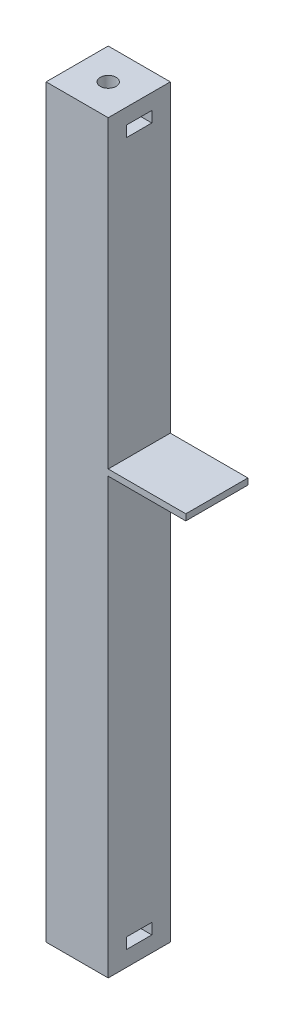
ISO-10303-21;
HEADER;
FILE_DESCRIPTION(('STEP AP214'),'2;1');
FILE_NAME('part.step','',(''),(''),'','','');
FILE_SCHEMA(('AUTOMOTIVE_DESIGN { 1 0 10303 214 1 1 1 1 }'));
ENDSEC;
DATA;
#1=APPLICATION_CONTEXT('core data for automotive mechanical design processes');
#2=APPLICATION_PROTOCOL_DEFINITION('international standard','automotive_design',2000,#1);
#3=PRODUCT_CONTEXT('',#1,'mechanical');
#4=PRODUCT('Part','Part','',(#3));
#5=PRODUCT_RELATED_PRODUCT_CATEGORY('part','',(#4));
#6=PRODUCT_DEFINITION_FORMATION('','',#4);
#7=PRODUCT_DEFINITION_CONTEXT('part definition',#1,'design');
#8=PRODUCT_DEFINITION('design','',#6,#7);
#9=PRODUCT_DEFINITION_SHAPE('','',#8);
#10=(LENGTH_UNIT() NAMED_UNIT(*) SI_UNIT(.MILLI.,.METRE.));
#11=(NAMED_UNIT(*) PLANE_ANGLE_UNIT() SI_UNIT($,.RADIAN.));
#12=(NAMED_UNIT(*) SI_UNIT($,.STERADIAN.) SOLID_ANGLE_UNIT());
#13=UNCERTAINTY_MEASURE_WITH_UNIT(LENGTH_MEASURE(1.E-05),#10,'distance_accuracy_value','');
#14=(GEOMETRIC_REPRESENTATION_CONTEXT(3) GLOBAL_UNCERTAINTY_ASSIGNED_CONTEXT((#13)) GLOBAL_UNIT_ASSIGNED_CONTEXT((#10,
#11,#12)) REPRESENTATION_CONTEXT('',''));
#15=CARTESIAN_POINT('',(0.,0.,0.));
#16=DIRECTION('',(0.,0.,1.));
#17=DIRECTION('',(1.,0.,0.));
#18=AXIS2_PLACEMENT_3D('',#15,#16,#17);
#19=CARTESIAN_POINT('',(10.,240.,-10.));
#20=DIRECTION('',(-1.,0.,0.));
#21=DIRECTION('',(0.,0.,1.));
#22=AXIS2_PLACEMENT_3D('',#19,#20,#21);
#23=PLANE('',#22);
#24=DIRECTION('',(0.,0.,1.));
#25=VECTOR('',#24,1.);
#26=CARTESIAN_POINT('',(10.,8.50000000000001,-4.04999999999992));
#27=LINE('',#26,#25);
#28=CARTESIAN_POINT('',(10.,8.50000000000001,-4.04999999999992));
#29=VERTEX_POINT('',#28);
#30=CARTESIAN_POINT('',(10.,8.50000000000001,4.05000000000008));
#31=VERTEX_POINT('',#30);
#32=EDGE_CURVE('E273',#29,#31,#27,.T.);
#33=ORIENTED_EDGE('',*,*,#32,.F.);
#34=DIRECTION('',(0.,1.,0.));
#35=VECTOR('',#34,1.);
#36=CARTESIAN_POINT('',(10.,5.,-4.04999999999991));
#37=LINE('',#36,#35);
#38=CARTESIAN_POINT('',(10.,5.,-4.04999999999991));
#39=VERTEX_POINT('',#38);
#40=EDGE_CURVE('E238',#39,#29,#37,.T.);
#41=ORIENTED_EDGE('',*,*,#40,.F.);
#42=DIRECTION('',(0.,0.,1.));
#43=VECTOR('',#42,1.);
#44=CARTESIAN_POINT('',(10.,5.,-4.04999999999991));
#45=LINE('',#44,#43);
#46=CARTESIAN_POINT('',(10.,5.,4.05000000000008));
#47=VERTEX_POINT('',#46);
#48=EDGE_CURVE('E266',#39,#47,#45,.T.);
#49=ORIENTED_EDGE('',*,*,#48,.T.);
#50=DIRECTION('',(0.,1.,0.));
#51=VECTOR('',#50,1.);
#52=CARTESIAN_POINT('',(10.,5.,4.05000000000008));
#53=LINE('',#52,#51);
#54=EDGE_CURVE('E269',#47,#31,#53,.T.);
#55=ORIENTED_EDGE('',*,*,#54,.T.);
#56=EDGE_LOOP('',(#33,#41,#49,#55));
#57=FACE_BOUND('',#56,.T.);
#58=DIRECTION('',(0.,0.,-1.));
#59=VECTOR('',#58,1.);
#60=CARTESIAN_POINT('',(10.,140.,0.));
#61=LINE('',#60,#59);
#62=CARTESIAN_POINT('',(10.,140.,10.));
#63=VERTEX_POINT('',#62);
#64=CARTESIAN_POINT('',(10.,140.,-10.));
#65=VERTEX_POINT('',#64);
#66=EDGE_CURVE('E48',#63,#65,#61,.T.);
#67=ORIENTED_EDGE('',*,*,#66,.F.);
#68=DIRECTION('',(0.,-1.,0.));
#69=VECTOR('',#68,1.);
#70=CARTESIAN_POINT('',(10.,240.,10.));
#71=LINE('',#70,#69);
#72=CARTESIAN_POINT('',(10.,0.,10.));
#73=VERTEX_POINT('',#72);
#74=EDGE_CURVE('E186',#63,#73,#71,.T.);
#75=ORIENTED_EDGE('',*,*,#74,.T.);
#76=DIRECTION('',(0.,0.,-1.));
#77=VECTOR('',#76,1.);
#78=CARTESIAN_POINT('',(10.,0.,-10.));
#79=LINE('',#78,#77);
#80=CARTESIAN_POINT('',(10.,0.,-10.));
#81=VERTEX_POINT('',#80);
#82=EDGE_CURVE('E250',#73,#81,#79,.T.);
#83=ORIENTED_EDGE('',*,*,#82,.T.);
#84=DIRECTION('',(0.,-1.,0.));
#85=VECTOR('',#84,1.);
#86=CARTESIAN_POINT('',(10.,240.,-10.));
#87=LINE('',#86,#85);
#88=EDGE_CURVE('E313',#65,#81,#87,.T.);
#89=ORIENTED_EDGE('',*,*,#88,.F.);
#90=EDGE_LOOP('',(#67,#75,#83,#89));
#91=FACE_BOUND('',#90,.T.);
#92=ADVANCED_FACE('F33',(#57,#91),#23,.F.);
#93=CARTESIAN_POINT('',(0.,0.,0.));
#94=DIRECTION('',(1.,0.,0.));
#95=DIRECTION('',(0.,0.,-1.));
#96=AXIS2_PLACEMENT_3D('',#93,#94,#95);
#97=PLANE('',#96);
#98=DIRECTION('',(0.,-1.,0.));
#99=VECTOR('',#98,1.);
#100=CARTESIAN_POINT('',(0.,25.,2.55));
#101=LINE('',#100,#99);
#102=CARTESIAN_POINT('',(0.,8.50000000000001,2.55));
#103=VERTEX_POINT('',#102);
#104=CARTESIAN_POINT('',(0.,5.,2.55));
#105=VERTEX_POINT('',#104);
#106=EDGE_CURVE('E11',#103,#105,#101,.T.);
#107=ORIENTED_EDGE('',*,*,#106,.F.);
#108=DIRECTION('',(0.,0.,1.));
#109=VECTOR('',#108,1.);
#110=CARTESIAN_POINT('',(0.,8.50000000000001,-4.04999999999992));
#111=LINE('',#110,#109);
#112=CARTESIAN_POINT('',(0.,8.50000000000001,4.05000000000008));
#113=VERTEX_POINT('',#112);
#114=EDGE_CURVE('E283',#103,#113,#111,.T.);
#115=ORIENTED_EDGE('',*,*,#114,.T.);
#116=DIRECTION('',(0.,1.,0.));
#117=VECTOR('',#116,1.);
#118=CARTESIAN_POINT('',(0.,5.,4.05000000000008));
#119=LINE('',#118,#117);
#120=CARTESIAN_POINT('',(0.,5.,4.05000000000008));
#121=VERTEX_POINT('',#120);
#122=EDGE_CURVE('E280',#121,#113,#119,.T.);
#123=ORIENTED_EDGE('',*,*,#122,.F.);
#124=DIRECTION('',(0.,0.,1.));
#125=VECTOR('',#124,1.);
#126=CARTESIAN_POINT('',(0.,5.,-4.04999999999991));
#127=LINE('',#126,#125);
#128=EDGE_CURVE('E260',#105,#121,#127,.T.);
#129=ORIENTED_EDGE('',*,*,#128,.F.);
#130=EDGE_LOOP('',(#107,#115,#123,#129));
#131=FACE_BOUND('',#130,.T.);
#132=ADVANCED_FACE('F344',(#131),#97,.T.);
#133=CARTESIAN_POINT('',(0.,215.,0.));
#134=DIRECTION('',(0.,1.,0.));
#135=DIRECTION('',(0.,0.,1.));
#136=AXIS2_PLACEMENT_3D('',#133,#134,#135);
#137=CYLINDRICAL_SURFACE('',#136,2.55);
#138=CARTESIAN_POINT('',(0.,215.,0.));
#139=DIRECTION('',(0.,1.,0.));
#140=DIRECTION('',(0.,0.,1.));
#141=AXIS2_PLACEMENT_3D('',#138,#139,#140);
#142=CIRCLE('',#141,2.55);
#143=CARTESIAN_POINT('',(0.,215.,2.55));
#144=VERTEX_POINT('',#143);
#145=EDGE_CURVE('E223',#144,#144,#142,.T.);
#146=ORIENTED_EDGE('',*,*,#145,.F.);
#147=EDGE_LOOP('',(#146));
#148=FACE_BOUND('',#147,.T.);
#149=CARTESIAN_POINT('',(0.,231.5,0.));
#150=DIRECTION('',(0.,1.,0.));
#151=DIRECTION('',(0.,0.,1.));
#152=AXIS2_PLACEMENT_3D('',#149,#150,#151);
#153=CIRCLE('',#152,2.55);
#154=CARTESIAN_POINT('',(0.,231.5,2.55));
#155=VERTEX_POINT('',#154);
#156=EDGE_CURVE('E226',#155,#155,#153,.T.);
#157=ORIENTED_EDGE('',*,*,#156,.T.);
#158=EDGE_LOOP('',(#157));
#159=FACE_BOUND('',#158,.T.);
#160=ADVANCED_FACE('F363',(#148,#159),#137,.F.);
#161=DIRECTION('',(0.,-1.,0.));
#162=VECTOR('',#161,1.);
#163=CARTESIAN_POINT('',(10.,235.,4.05000000000008));
#164=LINE('',#163,#162);
#165=CARTESIAN_POINT('',(10.,235.,4.05000000000008));
#166=VERTEX_POINT('',#165);
#167=CARTESIAN_POINT('',(10.,231.5,4.05000000000008));
#168=VERTEX_POINT('',#167);
#169=EDGE_CURVE('E237',#166,#168,#164,.T.);
#170=ORIENTED_EDGE('',*,*,#169,.F.);
#171=DIRECTION('',(0.,0.,1.));
#172=VECTOR('',#171,1.);
#173=CARTESIAN_POINT('',(10.,235.,-4.04999999999991));
#174=LINE('',#173,#172);
#175=CARTESIAN_POINT('',(10.,235.,-4.04999999999991));
#176=VERTEX_POINT('',#175);
#177=EDGE_CURVE('E235',#176,#166,#174,.T.);
#178=ORIENTED_EDGE('',*,*,#177,.F.);
#179=DIRECTION('',(0.,-1.,0.));
#180=VECTOR('',#179,1.);
#181=CARTESIAN_POINT('',(10.,235.,-4.04999999999991));
#182=LINE('',#181,#180);
#183=CARTESIAN_POINT('',(10.,231.5,-4.04999999999992));
#184=VERTEX_POINT('',#183);
#185=EDGE_CURVE('E244',#176,#184,#182,.T.);
#186=ORIENTED_EDGE('',*,*,#185,.T.);
#187=DIRECTION('',(0.,0.,1.));
#188=VECTOR('',#187,1.);
#189=CARTESIAN_POINT('',(10.,231.5,-4.04999999999992));
#190=LINE('',#189,#188);
#191=EDGE_CURVE('E241',#184,#168,#190,.T.);
#192=ORIENTED_EDGE('',*,*,#191,.T.);
#193=EDGE_LOOP('',(#170,#178,#186,#192));
#194=FACE_BOUND('',#193,.T.);
#195=CARTESIAN_POINT('',(10.,240.,10.));
#196=VERTEX_POINT('',#195);
#197=CARTESIAN_POINT('',(10.,142.,10.));
#198=VERTEX_POINT('',#197);
#199=EDGE_CURVE('E56',#196,#198,#71,.T.);
#200=ORIENTED_EDGE('',*,*,#199,.T.);
#201=DIRECTION('',(0.,0.,-1.));
#202=VECTOR('',#201,1.);
#203=CARTESIAN_POINT('',(10.,142.,0.));
#204=LINE('',#203,#202);
#205=CARTESIAN_POINT('',(10.,142.,-10.));
#206=VERTEX_POINT('',#205);
#207=EDGE_CURVE('E182',#198,#206,#204,.T.);
#208=ORIENTED_EDGE('',*,*,#207,.T.);
#209=CARTESIAN_POINT('',(10.,240.,-10.));
#210=VERTEX_POINT('',#209);
#211=EDGE_CURVE('E314',#210,#206,#87,.T.);
#212=ORIENTED_EDGE('',*,*,#211,.F.);
#213=DIRECTION('',(0.,0.,-1.));
#214=VECTOR('',#213,1.);
#215=CARTESIAN_POINT('',(10.,240.,-10.));
#216=LINE('',#215,#214);
#217=EDGE_CURVE('E289',#196,#210,#216,.T.);
#218=ORIENTED_EDGE('',*,*,#217,.F.);
#219=EDGE_LOOP('',(#200,#208,#212,#218));
#220=FACE_BOUND('',#219,.T.);
#221=ADVANCED_FACE('F35',(#194,#220),#23,.F.);
#222=CARTESIAN_POINT('',(-10.,240.,-10.));
#223=DIRECTION('',(0.,0.,1.));
#224=DIRECTION('',(1.,0.,0.));
#225=AXIS2_PLACEMENT_3D('',#222,#223,#224);
#226=PLANE('',#225);
#227=DIRECTION('',(-1.,0.,0.));
#228=VECTOR('',#227,1.);
#229=CARTESIAN_POINT('',(-10.,0.,-10.));
#230=LINE('',#229,#228);
#231=CARTESIAN_POINT('',(-10.,0.,-10.));
#232=VERTEX_POINT('',#231);
#233=EDGE_CURVE('E301',#81,#232,#230,.T.);
#234=ORIENTED_EDGE('',*,*,#233,.T.);
#235=DIRECTION('',(0.,-1.,0.));
#236=VECTOR('',#235,1.);
#237=CARTESIAN_POINT('',(-10.,240.,-10.));
#238=LINE('',#237,#236);
#239=CARTESIAN_POINT('',(-10.,240.,-10.));
#240=VERTEX_POINT('',#239);
#241=EDGE_CURVE('E310',#240,#232,#238,.T.);
#242=ORIENTED_EDGE('',*,*,#241,.F.);
#243=DIRECTION('',(-1.,0.,0.));
#244=VECTOR('',#243,1.);
#245=CARTESIAN_POINT('',(-10.,240.,-10.));
#246=LINE('',#245,#244);
#247=EDGE_CURVE('E292',#210,#240,#246,.T.);
#248=ORIENTED_EDGE('',*,*,#247,.F.);
#249=ORIENTED_EDGE('',*,*,#211,.T.);
#250=DIRECTION('',(-1.,0.,0.));
#251=VECTOR('',#250,1.);
#252=CARTESIAN_POINT('',(35.,142.,-10.));
#253=LINE('',#252,#251);
#254=CARTESIAN_POINT('',(35.,142.,-10.));
#255=VERTEX_POINT('',#254);
#256=EDGE_CURVE('E192',#255,#206,#253,.T.);
#257=ORIENTED_EDGE('',*,*,#256,.F.);
#258=DIRECTION('',(0.,1.,0.));
#259=VECTOR('',#258,1.);
#260=CARTESIAN_POINT('',(35.,0.,-10.));
#261=LINE('',#260,#259);
#262=CARTESIAN_POINT('',(35.,140.,-10.));
#263=VERTEX_POINT('',#262);
#264=EDGE_CURVE('E173',#263,#255,#261,.T.);
#265=ORIENTED_EDGE('',*,*,#264,.F.);
#266=DIRECTION('',(-1.,0.,0.));
#267=VECTOR('',#266,1.);
#268=CARTESIAN_POINT('',(35.,140.,-10.));
#269=LINE('',#268,#267);
#270=EDGE_CURVE('E170',#263,#65,#269,.T.);
#271=ORIENTED_EDGE('',*,*,#270,.T.);
#272=ORIENTED_EDGE('',*,*,#88,.T.);
#273=EDGE_LOOP('',(#234,#242,#248,#249,#257,#265,#271,#272));
#274=FACE_BOUND('',#273,.T.);
#275=ADVANCED_FACE('F364',(#274),#226,.F.);
#276=CARTESIAN_POINT('',(-10.,240.,-10.));
#277=DIRECTION('',(1.,0.,0.));
#278=DIRECTION('',(0.,0.,-1.));
#279=AXIS2_PLACEMENT_3D('',#276,#277,#278);
#280=PLANE('',#279);
#281=DIRECTION('',(0.,0.,1.));
#282=VECTOR('',#281,1.);
#283=CARTESIAN_POINT('',(-10.,0.,-10.));
#284=LINE('',#283,#282);
#285=CARTESIAN_POINT('',(-10.,0.,10.));
#286=VERTEX_POINT('',#285);
#287=EDGE_CURVE('E303',#232,#286,#284,.T.);
#288=ORIENTED_EDGE('',*,*,#287,.T.);
#289=DIRECTION('',(0.,-1.,0.));
#290=VECTOR('',#289,1.);
#291=CARTESIAN_POINT('',(-10.,240.,10.));
#292=LINE('',#291,#290);
#293=CARTESIAN_POINT('',(-10.,240.,10.));
#294=VERTEX_POINT('',#293);
#295=EDGE_CURVE('E307',#294,#286,#292,.T.);
#296=ORIENTED_EDGE('',*,*,#295,.F.);
#297=DIRECTION('',(0.,0.,1.));
#298=VECTOR('',#297,1.);
#299=CARTESIAN_POINT('',(-10.,240.,-10.));
#300=LINE('',#299,#298);
#301=EDGE_CURVE('E295',#240,#294,#300,.T.);
#302=ORIENTED_EDGE('',*,*,#301,.F.);
#303=ORIENTED_EDGE('',*,*,#241,.T.);
#304=EDGE_LOOP('',(#288,#296,#302,#303));
#305=FACE_BOUND('',#304,.T.);
#306=ADVANCED_FACE('F370',(#305),#280,.F.);
#307=CARTESIAN_POINT('',(-10.,240.,10.));
#308=DIRECTION('',(0.,0.,-1.));
#309=DIRECTION('',(-1.,0.,0.));
#310=AXIS2_PLACEMENT_3D('',#307,#308,#309);
#311=PLANE('',#310);
#312=DIRECTION('',(1.,0.,0.));
#313=VECTOR('',#312,1.);
#314=CARTESIAN_POINT('',(-10.,0.,10.));
#315=LINE('',#314,#313);
#316=EDGE_CURVE('E293',#286,#73,#315,.T.);
#317=ORIENTED_EDGE('',*,*,#316,.T.);
#318=ORIENTED_EDGE('',*,*,#74,.F.);
#319=DIRECTION('',(-1.,0.,0.));
#320=VECTOR('',#319,1.);
#321=CARTESIAN_POINT('',(35.,140.,10.));
#322=LINE('',#321,#320);
#323=CARTESIAN_POINT('',(35.,140.,10.));
#324=VERTEX_POINT('',#323);
#325=EDGE_CURVE('E168',#324,#63,#322,.T.);
#326=ORIENTED_EDGE('',*,*,#325,.F.);
#327=DIRECTION('',(0.,-1.,0.));
#328=VECTOR('',#327,1.);
#329=CARTESIAN_POINT('',(35.,0.,10.));
#330=LINE('',#329,#328);
#331=CARTESIAN_POINT('',(35.,142.,10.));
#332=VERTEX_POINT('',#331);
#333=EDGE_CURVE('E174',#332,#324,#330,.T.);
#334=ORIENTED_EDGE('',*,*,#333,.F.);
#335=DIRECTION('',(-1.,0.,0.));
#336=VECTOR('',#335,1.);
#337=CARTESIAN_POINT('',(35.,142.,10.));
#338=LINE('',#337,#336);
#339=EDGE_CURVE('E446',#332,#198,#338,.T.);
#340=ORIENTED_EDGE('',*,*,#339,.T.);
#341=ORIENTED_EDGE('',*,*,#199,.F.);
#342=DIRECTION('',(1.,0.,0.));
#343=VECTOR('',#342,1.);
#344=CARTESIAN_POINT('',(-10.,240.,10.));
#345=LINE('',#344,#343);
#346=EDGE_CURVE('E297',#294,#196,#345,.T.);
#347=ORIENTED_EDGE('',*,*,#346,.F.);
#348=ORIENTED_EDGE('',*,*,#295,.T.);
#349=EDGE_LOOP('',(#317,#318,#326,#334,#340,#341,#347,#348));
#350=FACE_BOUND('',#349,.T.);
#351=ADVANCED_FACE('F185',(#350),#311,.F.);
#352=CARTESIAN_POINT('',(0.,240.,0.));
#353=DIRECTION('',(0.,1.,0.));
#354=DIRECTION('',(0.,0.,1.));
#355=AXIS2_PLACEMENT_3D('',#352,#353,#354);
#356=PLANE('',#355);
#357=CARTESIAN_POINT('',(0.,240.,0.));
#358=DIRECTION('',(0.,1.,0.));
#359=DIRECTION('',(0.,0.,1.));
#360=AXIS2_PLACEMENT_3D('',#357,#358,#359);
#361=CIRCLE('',#360,2.55);
#362=CARTESIAN_POINT('',(0.,240.,2.55));
#363=VERTEX_POINT('',#362);
#364=EDGE_CURVE('E222',#363,#363,#361,.T.);
#365=ORIENTED_EDGE('',*,*,#364,.F.);
#366=EDGE_LOOP('',(#365));
#367=FACE_BOUND('',#366,.T.);
#368=ORIENTED_EDGE('',*,*,#217,.T.);
#369=ORIENTED_EDGE('',*,*,#247,.T.);
#370=ORIENTED_EDGE('',*,*,#301,.T.);
#371=ORIENTED_EDGE('',*,*,#346,.T.);
#372=EDGE_LOOP('',(#368,#369,#370,#371));
#373=FACE_BOUND('',#372,.T.);
#374=ADVANCED_FACE('F420',(#367,#373),#356,.T.);
#375=CARTESIAN_POINT('',(0.,0.,0.));
#376=DIRECTION('',(0.,1.,0.));
#377=DIRECTION('',(0.,0.,1.));
#378=AXIS2_PLACEMENT_3D('',#375,#376,#377);
#379=PLANE('',#378);
#380=CARTESIAN_POINT('',(0.,0.,0.));
#381=DIRECTION('',(0.,-1.,0.));
#382=DIRECTION('',(0.,0.,-1.));
#383=AXIS2_PLACEMENT_3D('',#380,#381,#382);
#384=CIRCLE('',#383,2.55);
#385=CARTESIAN_POINT('',(0.,0.,-2.55));
#386=VERTEX_POINT('',#385);
#387=EDGE_CURVE('E187',#386,#386,#384,.T.);
#388=ORIENTED_EDGE('',*,*,#387,.F.);
#389=EDGE_LOOP('',(#388));
#390=FACE_BOUND('',#389,.T.);
#391=ORIENTED_EDGE('',*,*,#82,.F.);
#392=ORIENTED_EDGE('',*,*,#316,.F.);
#393=ORIENTED_EDGE('',*,*,#287,.F.);
#394=ORIENTED_EDGE('',*,*,#233,.F.);
#395=EDGE_LOOP('',(#391,#392,#393,#394));
#396=FACE_BOUND('',#395,.T.);
#397=ADVANCED_FACE('F354',(#390,#396),#379,.F.);
#398=CARTESIAN_POINT('',(0.,5.,-4.04999999999991));
#399=DIRECTION('',(0.,0.,-1.));
#400=DIRECTION('',(0.,1.,0.));
#401=AXIS2_PLACEMENT_3D('',#398,#399,#400);
#402=PLANE('',#401);
#403=ORIENTED_EDGE('',*,*,#40,.T.);
#404=DIRECTION('',(1.,0.,0.));
#405=VECTOR('',#404,1.);
#406=CARTESIAN_POINT('',(0.,8.50000000000001,-4.04999999999992));
#407=LINE('',#406,#405);
#408=CARTESIAN_POINT('',(0.,8.50000000000001,-4.04999999999992));
#409=VERTEX_POINT('',#408);
#410=EDGE_CURVE('E257',#409,#29,#407,.T.);
#411=ORIENTED_EDGE('',*,*,#410,.F.);
#412=DIRECTION('',(0.,1.,0.));
#413=VECTOR('',#412,1.);
#414=CARTESIAN_POINT('',(0.,5.,-4.04999999999991));
#415=LINE('',#414,#413);
#416=CARTESIAN_POINT('',(0.,5.,-4.04999999999991));
#417=VERTEX_POINT('',#416);
#418=EDGE_CURVE('E270',#417,#409,#415,.T.);
#419=ORIENTED_EDGE('',*,*,#418,.F.);
#420=DIRECTION('',(1.,0.,0.));
#421=VECTOR('',#420,1.);
#422=CARTESIAN_POINT('',(0.,5.,-4.04999999999991));
#423=LINE('',#422,#421);
#424=EDGE_CURVE('E234',#417,#39,#423,.T.);
#425=ORIENTED_EDGE('',*,*,#424,.T.);
#426=EDGE_LOOP('',(#403,#411,#419,#425));
#427=FACE_BOUND('',#426,.T.);
#428=ADVANCED_FACE('F332',(#427),#402,.F.);
#429=CARTESIAN_POINT('',(0.,5.,-4.04999999999991));
#430=DIRECTION('',(0.,1.,0.));
#431=DIRECTION('',(0.,0.,1.));
#432=AXIS2_PLACEMENT_3D('',#429,#430,#431);
#433=PLANE('',#432);
#434=CARTESIAN_POINT('',(0.,5.,0.));
#435=DIRECTION('',(0.,1.,0.));
#436=DIRECTION('',(0.,0.,1.));
#437=AXIS2_PLACEMENT_3D('',#434,#435,#436);
#438=CIRCLE('',#437,2.55);
#439=CARTESIAN_POINT('',(0.,5.,-2.55));
#440=VERTEX_POINT('',#439);
#441=EDGE_CURVE('E201',#105,#440,#438,.T.);
#442=ORIENTED_EDGE('',*,*,#441,.F.);
#443=ORIENTED_EDGE('',*,*,#128,.T.);
#444=DIRECTION('',(1.,0.,0.));
#445=VECTOR('',#444,1.);
#446=CARTESIAN_POINT('',(0.,5.,4.05000000000008));
#447=LINE('',#446,#445);
#448=EDGE_CURVE('E263',#121,#47,#447,.T.);
#449=ORIENTED_EDGE('',*,*,#448,.T.);
#450=ORIENTED_EDGE('',*,*,#48,.F.);
#451=ORIENTED_EDGE('',*,*,#424,.F.);
#452=EDGE_CURVE('E277',#417,#440,#127,.T.);
#453=ORIENTED_EDGE('',*,*,#452,.T.);
#454=EDGE_LOOP('',(#442,#443,#449,#450,#451,#453));
#455=FACE_BOUND('',#454,.T.);
#456=ADVANCED_FACE('F346',(#455),#433,.T.);
#457=CARTESIAN_POINT('',(0.,5.,4.05000000000008));
#458=DIRECTION('',(0.,0.,-1.));
#459=DIRECTION('',(0.,1.,0.));
#460=AXIS2_PLACEMENT_3D('',#457,#458,#459);
#461=PLANE('',#460);
#462=ORIENTED_EDGE('',*,*,#54,.F.);
#463=ORIENTED_EDGE('',*,*,#448,.F.);
#464=ORIENTED_EDGE('',*,*,#122,.T.);
#465=DIRECTION('',(1.,0.,0.));
#466=VECTOR('',#465,1.);
#467=CARTESIAN_POINT('',(0.,8.50000000000001,4.05000000000008));
#468=LINE('',#467,#466);
#469=EDGE_CURVE('E261',#113,#31,#468,.T.);
#470=ORIENTED_EDGE('',*,*,#469,.T.);
#471=EDGE_LOOP('',(#462,#463,#464,#470));
#472=FACE_BOUND('',#471,.T.);
#473=ADVANCED_FACE('F340',(#472),#461,.T.);
#474=CARTESIAN_POINT('',(0.,8.50000000000001,-4.04999999999992));
#475=DIRECTION('',(0.,1.,0.));
#476=DIRECTION('',(0.,0.,1.));
#477=AXIS2_PLACEMENT_3D('',#474,#475,#476);
#478=PLANE('',#477);
#479=ORIENTED_EDGE('',*,*,#114,.F.);
#480=CARTESIAN_POINT('',(0.,8.50000000000001,0.));
#481=DIRECTION('',(0.,1.,0.));
#482=DIRECTION('',(0.,0.,1.));
#483=AXIS2_PLACEMENT_3D('',#480,#481,#482);
#484=CIRCLE('',#483,2.55);
#485=CARTESIAN_POINT('',(0.,8.50000000000001,-2.55));
#486=VERTEX_POINT('',#485);
#487=EDGE_CURVE('E197',#103,#486,#484,.T.);
#488=ORIENTED_EDGE('',*,*,#487,.T.);
#489=EDGE_CURVE('E284',#409,#486,#111,.T.);
#490=ORIENTED_EDGE('',*,*,#489,.F.);
#491=ORIENTED_EDGE('',*,*,#410,.T.);
#492=ORIENTED_EDGE('',*,*,#32,.T.);
#493=ORIENTED_EDGE('',*,*,#469,.F.);
#494=EDGE_LOOP('',(#479,#488,#490,#491,#492,#493));
#495=FACE_BOUND('',#494,.T.);
#496=ADVANCED_FACE('F327',(#495),#478,.F.);
#497=DIRECTION('',(0.,-1.,0.));
#498=VECTOR('',#497,1.);
#499=CARTESIAN_POINT('',(0.,25.,-2.55));
#500=LINE('',#499,#498);
#501=EDGE_CURVE('E41',#440,#486,#500,.F.);
#502=ORIENTED_EDGE('',*,*,#501,.F.);
#503=ORIENTED_EDGE('',*,*,#452,.F.);
#504=ORIENTED_EDGE('',*,*,#418,.T.);
#505=ORIENTED_EDGE('',*,*,#489,.T.);
#506=EDGE_LOOP('',(#502,#503,#504,#505));
#507=FACE_BOUND('',#506,.T.);
#508=ADVANCED_FACE('F329',(#507),#97,.T.);
#509=CARTESIAN_POINT('',(0.,235.,-4.04999999999991));
#510=DIRECTION('',(0.,1.,0.));
#511=DIRECTION('',(0.,0.,1.));
#512=AXIS2_PLACEMENT_3D('',#509,#510,#511);
#513=PLANE('',#512);
#514=CARTESIAN_POINT('',(0.,235.,0.));
#515=DIRECTION('',(0.,1.,0.));
#516=DIRECTION('',(0.,0.,1.));
#517=AXIS2_PLACEMENT_3D('',#514,#515,#516);
#518=CIRCLE('',#517,2.55);
#519=CARTESIAN_POINT('',(0.,235.,2.55));
#520=VERTEX_POINT('',#519);
#521=EDGE_CURVE('E231',#520,#520,#518,.T.);
#522=ORIENTED_EDGE('',*,*,#521,.T.);
#523=EDGE_LOOP('',(#522));
#524=FACE_BOUND('',#523,.T.);
#525=DIRECTION('',(1.,0.,0.));
#526=VECTOR('',#525,1.);
#527=CARTESIAN_POINT('',(0.,235.,4.05000000000008));
#528=LINE('',#527,#526);
#529=CARTESIAN_POINT('',(-2.33826859021799,235.,4.05));
#530=VERTEX_POINT('',#529);
#531=EDGE_CURVE('E247',#530,#166,#528,.T.);
#532=ORIENTED_EDGE('',*,*,#531,.F.);
#533=DIRECTION('',(0.5,0.,0.866025403784439));
#534=VECTOR('',#533,1.);
#535=CARTESIAN_POINT('',(-3.50740288532698,235.,2.025));
#536=LINE('',#535,#534);
#537=CARTESIAN_POINT('',(-4.67653718043597,235.,0.));
#538=VERTEX_POINT('',#537);
#539=EDGE_CURVE('E206',#538,#530,#536,.T.);
#540=ORIENTED_EDGE('',*,*,#539,.F.);
#541=DIRECTION('',(-0.5,0.,0.866025403784439));
#542=VECTOR('',#541,1.);
#543=CARTESIAN_POINT('',(-3.50740288532698,235.,-2.025));
#544=LINE('',#543,#542);
#545=CARTESIAN_POINT('',(-2.33826859021798,235.,-4.05));
#546=VERTEX_POINT('',#545);
#547=EDGE_CURVE('E204',#546,#538,#544,.T.);
#548=ORIENTED_EDGE('',*,*,#547,.F.);
#549=DIRECTION('',(1.,0.,0.));
#550=VECTOR('',#549,1.);
#551=CARTESIAN_POINT('',(0.,235.,-4.04999999999991));
#552=LINE('',#551,#550);
#553=EDGE_CURVE('E248',#546,#176,#552,.T.);
#554=ORIENTED_EDGE('',*,*,#553,.T.);
#555=ORIENTED_EDGE('',*,*,#177,.T.);
#556=EDGE_LOOP('',(#532,#540,#548,#554,#555));
#557=FACE_BOUND('',#556,.T.);
#558=ADVANCED_FACE('F384',(#524,#557),#513,.F.);
#559=CARTESIAN_POINT('',(0.,235.,-4.04999999999991));
#560=DIRECTION('',(0.,0.,1.));
#561=DIRECTION('',(0.,-1.,0.));
#562=AXIS2_PLACEMENT_3D('',#559,#560,#561);
#563=PLANE('',#562);
#564=ORIENTED_EDGE('',*,*,#185,.F.);
#565=ORIENTED_EDGE('',*,*,#553,.F.);
#566=DIRECTION('',(0.,-1.,0.));
#567=VECTOR('',#566,1.);
#568=CARTESIAN_POINT('',(-2.33826859021798,235.,-4.05));
#569=LINE('',#568,#567);
#570=CARTESIAN_POINT('',(-2.33826859021798,231.5,-4.05));
#571=VERTEX_POINT('',#570);
#572=EDGE_CURVE('E219',#546,#571,#569,.T.);
#573=ORIENTED_EDGE('',*,*,#572,.T.);
#574=DIRECTION('',(1.,0.,0.));
#575=VECTOR('',#574,1.);
#576=CARTESIAN_POINT('',(0.,231.5,-4.04999999999992));
#577=LINE('',#576,#575);
#578=EDGE_CURVE('E251',#571,#184,#577,.T.);
#579=ORIENTED_EDGE('',*,*,#578,.T.);
#580=EDGE_LOOP('',(#564,#565,#573,#579));
#581=FACE_BOUND('',#580,.T.);
#582=ADVANCED_FACE('F396',(#581),#563,.T.);
#583=CARTESIAN_POINT('',(0.,231.5,-4.04999999999992));
#584=DIRECTION('',(0.,1.,0.));
#585=DIRECTION('',(0.,0.,1.));
#586=AXIS2_PLACEMENT_3D('',#583,#584,#585);
#587=PLANE('',#586);
#588=ORIENTED_EDGE('',*,*,#156,.F.);
#589=EDGE_LOOP('',(#588));
#590=FACE_BOUND('',#589,.T.);
#591=ORIENTED_EDGE('',*,*,#578,.F.);
#592=DIRECTION('',(-0.5,0.,0.866025403784439));
#593=VECTOR('',#592,1.);
#594=CARTESIAN_POINT('',(-3.50740288532698,231.5,-2.025));
#595=LINE('',#594,#593);
#596=CARTESIAN_POINT('',(-4.67653718043597,231.5,0.));
#597=VERTEX_POINT('',#596);
#598=EDGE_CURVE('E203',#571,#597,#595,.T.);
#599=ORIENTED_EDGE('',*,*,#598,.T.);
#600=DIRECTION('',(0.5,0.,0.866025403784439));
#601=VECTOR('',#600,1.);
#602=CARTESIAN_POINT('',(-3.50740288532698,231.5,2.025));
#603=LINE('',#602,#601);
#604=CARTESIAN_POINT('',(-2.33826859021799,231.5,4.05));
#605=VERTEX_POINT('',#604);
#606=EDGE_CURVE('E207',#597,#605,#603,.T.);
#607=ORIENTED_EDGE('',*,*,#606,.T.);
#608=DIRECTION('',(1.,0.,0.));
#609=VECTOR('',#608,1.);
#610=CARTESIAN_POINT('',(0.,231.5,4.05000000000008));
#611=LINE('',#610,#609);
#612=EDGE_CURVE('E253',#605,#168,#611,.T.);
#613=ORIENTED_EDGE('',*,*,#612,.T.);
#614=ORIENTED_EDGE('',*,*,#191,.F.);
#615=EDGE_LOOP('',(#591,#599,#607,#613,#614));
#616=FACE_BOUND('',#615,.T.);
#617=ADVANCED_FACE('F398',(#590,#616),#587,.T.);
#618=CARTESIAN_POINT('',(0.,235.,4.05000000000008));
#619=DIRECTION('',(0.,0.,1.));
#620=DIRECTION('',(0.,-1.,0.));
#621=AXIS2_PLACEMENT_3D('',#618,#619,#620);
#622=PLANE('',#621);
#623=ORIENTED_EDGE('',*,*,#169,.T.);
#624=ORIENTED_EDGE('',*,*,#612,.F.);
#625=DIRECTION('',(0.,-1.,0.));
#626=VECTOR('',#625,1.);
#627=CARTESIAN_POINT('',(-2.33826859021799,235.,4.05));
#628=LINE('',#627,#626);
#629=EDGE_CURVE('E210',#530,#605,#628,.T.);
#630=ORIENTED_EDGE('',*,*,#629,.F.);
#631=ORIENTED_EDGE('',*,*,#531,.T.);
#632=EDGE_LOOP('',(#623,#624,#630,#631));
#633=FACE_BOUND('',#632,.T.);
#634=ADVANCED_FACE('F380',(#633),#622,.F.);
#635=ORIENTED_EDGE('',*,*,#521,.F.);
#636=EDGE_LOOP('',(#635));
#637=FACE_BOUND('',#636,.T.);
#638=ORIENTED_EDGE('',*,*,#364,.T.);
#639=EDGE_LOOP('',(#638));
#640=FACE_BOUND('',#639,.T.);
#641=ADVANCED_FACE('F375',(#637,#640),#137,.F.);
#642=CARTESIAN_POINT('',(0.,215.,0.));
#643=DIRECTION('',(0.,1.,0.));
#644=DIRECTION('',(0.,0.,1.));
#645=AXIS2_PLACEMENT_3D('',#642,#643,#644);
#646=PLANE('',#645);
#647=ORIENTED_EDGE('',*,*,#145,.T.);
#648=EDGE_LOOP('',(#647));
#649=FACE_BOUND('',#648,.T.);
#650=ADVANCED_FACE('F474',(#649),#646,.T.);
#651=CARTESIAN_POINT('',(-3.50740288532698,235.,-2.025));
#652=DIRECTION('',(0.866025403784439,0.,0.5));
#653=DIRECTION('',(0.5,0.,-0.866025403784439));
#654=AXIS2_PLACEMENT_3D('',#651,#652,#653);
#655=PLANE('',#654);
#656=ORIENTED_EDGE('',*,*,#598,.F.);
#657=ORIENTED_EDGE('',*,*,#572,.F.);
#658=ORIENTED_EDGE('',*,*,#547,.T.);
#659=DIRECTION('',(0.,-1.,0.));
#660=VECTOR('',#659,1.);
#661=CARTESIAN_POINT('',(-4.67653718043597,235.,0.));
#662=LINE('',#661,#660);
#663=EDGE_CURVE('E216',#538,#597,#662,.T.);
#664=ORIENTED_EDGE('',*,*,#663,.T.);
#665=EDGE_LOOP('',(#656,#657,#658,#664));
#666=FACE_BOUND('',#665,.T.);
#667=ADVANCED_FACE('F392',(#666),#655,.T.);
#668=CARTESIAN_POINT('',(-3.50740288532698,235.,2.025));
#669=DIRECTION('',(0.866025403784438,0.,-0.5));
#670=DIRECTION('',(-0.5,0.,-0.866025403784439));
#671=AXIS2_PLACEMENT_3D('',#668,#669,#670);
#672=PLANE('',#671);
#673=ORIENTED_EDGE('',*,*,#606,.F.);
#674=ORIENTED_EDGE('',*,*,#663,.F.);
#675=ORIENTED_EDGE('',*,*,#539,.T.);
#676=ORIENTED_EDGE('',*,*,#629,.T.);
#677=EDGE_LOOP('',(#673,#674,#675,#676));
#678=FACE_BOUND('',#677,.T.);
#679=ADVANCED_FACE('F389',(#678),#672,.T.);
#680=CARTESIAN_POINT('',(0.,25.,0.));
#681=DIRECTION('',(0.,-1.,0.));
#682=DIRECTION('',(0.,0.,-1.));
#683=AXIS2_PLACEMENT_3D('',#680,#681,#682);
#684=CYLINDRICAL_SURFACE('',#683,2.55);
#685=ORIENTED_EDGE('',*,*,#106,.T.);
#686=ORIENTED_EDGE('',*,*,#441,.T.);
#687=ORIENTED_EDGE('',*,*,#501,.T.);
#688=ORIENTED_EDGE('',*,*,#487,.F.);
#689=EDGE_LOOP('',(#685,#686,#687,#688));
#690=FACE_BOUND('',#689,.T.);
#691=CARTESIAN_POINT('',(0.,25.,0.));
#692=DIRECTION('',(0.,-1.,0.));
#693=DIRECTION('',(0.,0.,-1.));
#694=AXIS2_PLACEMENT_3D('',#691,#692,#693);
#695=CIRCLE('',#694,2.55);
#696=CARTESIAN_POINT('',(0.,25.,-2.55));
#697=VERTEX_POINT('',#696);
#698=EDGE_CURVE('E190',#697,#697,#695,.T.);
#699=ORIENTED_EDGE('',*,*,#698,.F.);
#700=EDGE_LOOP('',(#699));
#701=FACE_BOUND('',#700,.T.);
#702=ORIENTED_EDGE('',*,*,#387,.T.);
#703=EDGE_LOOP('',(#702));
#704=FACE_BOUND('',#703,.T.);
#705=ADVANCED_FACE('F318',(#690,#701,#704),#684,.F.);
#706=CARTESIAN_POINT('',(0.,25.,0.));
#707=DIRECTION('',(0.,-1.,0.));
#708=DIRECTION('',(0.,0.,-1.));
#709=AXIS2_PLACEMENT_3D('',#706,#707,#708);
#710=PLANE('',#709);
#711=ORIENTED_EDGE('',*,*,#698,.T.);
#712=EDGE_LOOP('',(#711));
#713=FACE_BOUND('',#712,.T.);
#714=ADVANCED_FACE('F462',(#713),#710,.T.);
#715=CARTESIAN_POINT('',(35.,140.,0.));
#716=DIRECTION('',(0.,1.,0.));
#717=DIRECTION('',(0.,0.,1.));
#718=AXIS2_PLACEMENT_3D('',#715,#716,#717);
#719=PLANE('',#718);
#720=ORIENTED_EDGE('',*,*,#66,.T.);
#721=ORIENTED_EDGE('',*,*,#270,.F.);
#722=DIRECTION('',(0.,0.,-1.));
#723=VECTOR('',#722,1.);
#724=CARTESIAN_POINT('',(35.,140.,0.));
#725=LINE('',#724,#723);
#726=EDGE_CURVE('E164',#324,#263,#725,.T.);
#727=ORIENTED_EDGE('',*,*,#726,.F.);
#728=ORIENTED_EDGE('',*,*,#325,.T.);
#729=EDGE_LOOP('',(#720,#721,#727,#728));
#730=FACE_BOUND('',#729,.T.);
#731=ADVANCED_FACE('F166',(#730),#719,.F.);
#732=CARTESIAN_POINT('',(35.,142.,0.));
#733=DIRECTION('',(0.,1.,0.));
#734=DIRECTION('',(0.,0.,1.));
#735=AXIS2_PLACEMENT_3D('',#732,#733,#734);
#736=PLANE('',#735);
#737=ORIENTED_EDGE('',*,*,#207,.F.);
#738=ORIENTED_EDGE('',*,*,#339,.F.);
#739=DIRECTION('',(0.,0.,-1.));
#740=VECTOR('',#739,1.);
#741=CARTESIAN_POINT('',(35.,142.,0.));
#742=LINE('',#741,#740);
#743=EDGE_CURVE('E180',#332,#255,#742,.T.);
#744=ORIENTED_EDGE('',*,*,#743,.T.);
#745=ORIENTED_EDGE('',*,*,#256,.T.);
#746=EDGE_LOOP('',(#737,#738,#744,#745));
#747=FACE_BOUND('',#746,.T.);
#748=ADVANCED_FACE('F452',(#747),#736,.T.);
#749=CARTESIAN_POINT('',(35.,0.,0.));
#750=DIRECTION('',(1.,0.,0.));
#751=DIRECTION('',(0.,0.,-1.));
#752=AXIS2_PLACEMENT_3D('',#749,#750,#751);
#753=PLANE('',#752);
#754=ORIENTED_EDGE('',*,*,#333,.T.);
#755=ORIENTED_EDGE('',*,*,#726,.T.);
#756=ORIENTED_EDGE('',*,*,#264,.T.);
#757=ORIENTED_EDGE('',*,*,#743,.F.);
#758=EDGE_LOOP('',(#754,#755,#756,#757));
#759=FACE_BOUND('',#758,.T.);
#760=ADVANCED_FACE('F178',(#759),#753,.T.);
#761=CLOSED_SHELL('',(#92,#132,#160,#221,#275,#306,#351,#374,#397,#428,#456,#473,#496,#508,#558,
#582,#617,#634,#641,#650,#667,#679,#705,#714,#731,#748,#760));
#762=MANIFOLD_SOLID_BREP('B2',#761);
#763=ADVANCED_BREP_SHAPE_REPRESENTATION('',(#18,#762),#14);
#764=SHAPE_DEFINITION_REPRESENTATION(#9,#763);
ENDSEC;
END-ISO-10303-21;
